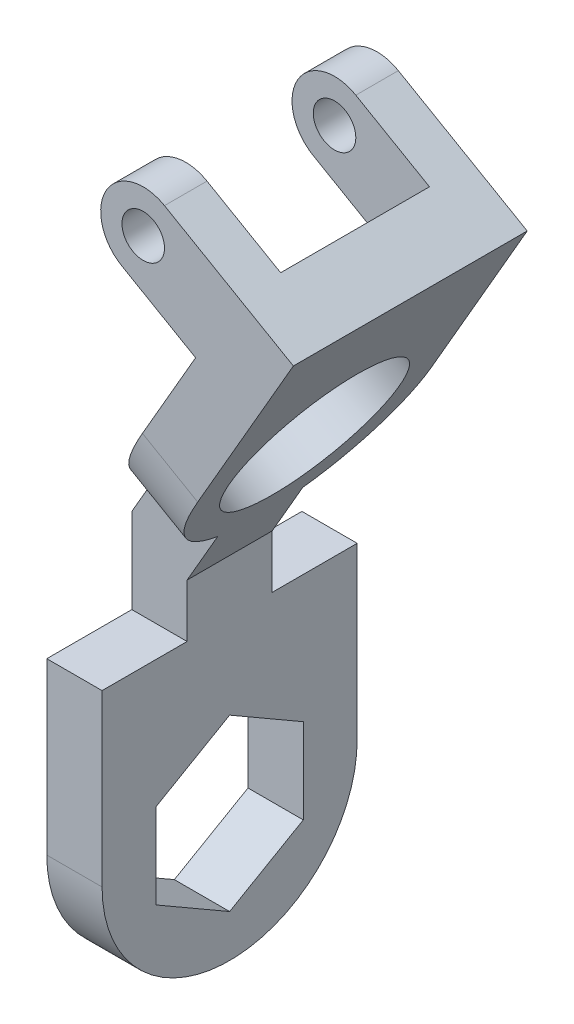
ISO-10303-21;
HEADER;
FILE_DESCRIPTION(('STEP AP214'),'2;1');
FILE_NAME('part.step','',(''),(''),'','','');
FILE_SCHEMA(('AUTOMOTIVE_DESIGN { 1 0 10303 214 1 1 1 1 }'));
ENDSEC;
DATA;
#1=APPLICATION_CONTEXT('core data for automotive mechanical design processes');
#2=APPLICATION_PROTOCOL_DEFINITION('international standard','automotive_design',2000,#1);
#3=PRODUCT_CONTEXT('',#1,'mechanical');
#4=PRODUCT('Part','Part','',(#3));
#5=PRODUCT_RELATED_PRODUCT_CATEGORY('part','',(#4));
#6=PRODUCT_DEFINITION_FORMATION('','',#4);
#7=PRODUCT_DEFINITION_CONTEXT('part definition',#1,'design');
#8=PRODUCT_DEFINITION('design','',#6,#7);
#9=PRODUCT_DEFINITION_SHAPE('','',#8);
#10=(LENGTH_UNIT() NAMED_UNIT(*) SI_UNIT(.MILLI.,.METRE.));
#11=(NAMED_UNIT(*) PLANE_ANGLE_UNIT() SI_UNIT($,.RADIAN.));
#12=(NAMED_UNIT(*) SI_UNIT($,.STERADIAN.) SOLID_ANGLE_UNIT());
#13=UNCERTAINTY_MEASURE_WITH_UNIT(LENGTH_MEASURE(1.E-05),#10,'distance_accuracy_value','');
#14=(GEOMETRIC_REPRESENTATION_CONTEXT(3) GLOBAL_UNCERTAINTY_ASSIGNED_CONTEXT((#13)) GLOBAL_UNIT_ASSIGNED_CONTEXT((#10,
#11,#12)) REPRESENTATION_CONTEXT('',''));
#15=CARTESIAN_POINT('',(0.,0.,0.));
#16=DIRECTION('',(0.,0.,1.));
#17=DIRECTION('',(1.,0.,0.));
#18=AXIS2_PLACEMENT_3D('',#15,#16,#17);
#19=CARTESIAN_POINT('',(70.4727839420931,160.162442338531,34.925));
#20=DIRECTION('',(-0.499999999999995,-0.866025403784442,0.));
#21=DIRECTION('',(0.866025403784442,-0.499999999999995,0.));
#22=AXIS2_PLACEMENT_3D('',#19,#20,#21);
#23=PLANE('',#22);
#24=DIRECTION('',(-0.866025403784439,0.5,0.));
#25=VECTOR('',#24,1.);
#26=CARTESIAN_POINT('',(53.9749999999994,169.68744233853,-22.225));
#27=LINE('',#26,#25);
#28=CARTESIAN_POINT('',(53.9749999999994,169.68744233853,-22.225));
#29=VERTEX_POINT('',#28);
#30=CARTESIAN_POINT('',(31.9779547438747,182.38744233853,-22.225));
#31=VERTEX_POINT('',#30);
#32=EDGE_CURVE('E230',#29,#31,#27,.T.);
#33=ORIENTED_EDGE('',*,*,#32,.F.);
#34=DIRECTION('',(0.,0.,1.));
#35=VECTOR('',#34,1.);
#36=CARTESIAN_POINT('',(53.9749999999994,169.68744233853,-22.225));
#37=LINE('',#36,#35);
#38=CARTESIAN_POINT('',(53.9749999999994,169.68744233853,22.225));
#39=VERTEX_POINT('',#38);
#40=EDGE_CURVE('E213',#29,#39,#37,.T.);
#41=ORIENTED_EDGE('',*,*,#40,.T.);
#42=DIRECTION('',(-0.866025403784439,0.5,0.));
#43=VECTOR('',#42,1.);
#44=CARTESIAN_POINT('',(53.9749999999994,169.68744233853,22.225));
#45=LINE('',#44,#43);
#46=CARTESIAN_POINT('',(31.9779547438747,182.38744233853,22.225));
#47=VERTEX_POINT('',#46);
#48=EDGE_CURVE('E245',#39,#47,#45,.T.);
#49=ORIENTED_EDGE('',*,*,#48,.T.);
#50=DIRECTION('',(0.,0.,1.));
#51=VECTOR('',#50,1.);
#52=CARTESIAN_POINT('',(31.9779547438747,182.38744233853,-34.925));
#53=LINE('',#52,#51);
#54=CARTESIAN_POINT('',(31.9779547438747,182.38744233853,34.925));
#55=VERTEX_POINT('',#54);
#56=EDGE_CURVE('E266',#47,#55,#53,.T.);
#57=ORIENTED_EDGE('',*,*,#56,.T.);
#58=DIRECTION('',(-0.866025403784442,0.499999999999995,0.));
#59=VECTOR('',#58,1.);
#60=CARTESIAN_POINT('',(70.4727839420931,160.162442338531,34.925));
#61=LINE('',#60,#59);
#62=CARTESIAN_POINT('',(70.4727839420931,160.162442338531,34.925));
#63=VERTEX_POINT('',#62);
#64=EDGE_CURVE('E316',#63,#55,#61,.T.);
#65=ORIENTED_EDGE('',*,*,#64,.F.);
#66=DIRECTION('',(0.,0.,1.));
#67=VECTOR('',#66,1.);
#68=CARTESIAN_POINT('',(70.4727839420931,160.162442338531,34.925));
#69=LINE('',#68,#67);
#70=CARTESIAN_POINT('',(70.4727839420931,160.162442338531,-34.925));
#71=VERTEX_POINT('',#70);
#72=EDGE_CURVE('E288',#71,#63,#69,.T.);
#73=ORIENTED_EDGE('',*,*,#72,.F.);
#74=DIRECTION('',(-0.866025403784442,0.499999999999995,0.));
#75=VECTOR('',#74,1.);
#76=CARTESIAN_POINT('',(70.4727839420931,160.162442338531,-34.925));
#77=LINE('',#76,#75);
#78=CARTESIAN_POINT('',(31.9779547438747,182.38744233853,-34.925));
#79=VERTEX_POINT('',#78);
#80=EDGE_CURVE('E319',#71,#79,#77,.T.);
#81=ORIENTED_EDGE('',*,*,#80,.T.);
#82=EDGE_CURVE('E237',#79,#31,#53,.T.);
#83=ORIENTED_EDGE('',*,*,#82,.T.);
#84=EDGE_LOOP('',(#33,#41,#49,#57,#65,#73,#81,#83));
#85=FACE_BOUND('',#84,.T.);
#86=ADVANCED_FACE('F39',(#85),#23,.F.);
#87=CARTESIAN_POINT('',(19.2779547438748,160.390397082406,-34.925));
#88=DIRECTION('',(-0.5,-0.866025403784439,0.));
#89=DIRECTION('',(0.866025403784439,-0.5,0.));
#90=AXIS2_PLACEMENT_3D('',#87,#88,#89);
#91=PLANE('',#90);
#92=DIRECTION('',(0.,0.,1.));
#93=VECTOR('',#92,1.);
#94=CARTESIAN_POINT('',(41.2749999999995,147.690397082406,-34.925));
#95=LINE('',#94,#93);
#96=CARTESIAN_POINT('',(41.2749999999995,147.690397082406,-34.925));
#97=VERTEX_POINT('',#96);
#98=CARTESIAN_POINT('',(41.2749999999995,147.690397082406,-22.225));
#99=VERTEX_POINT('',#98);
#100=EDGE_CURVE('E267',#97,#99,#95,.T.);
#101=ORIENTED_EDGE('',*,*,#100,.T.);
#102=DIRECTION('',(0.866025403784439,-0.5,0.));
#103=VECTOR('',#102,1.);
#104=CARTESIAN_POINT('',(19.2779547438748,160.390397082406,-22.225));
#105=LINE('',#104,#103);
#106=CARTESIAN_POINT('',(19.2779547438748,160.390397082406,-22.225));
#107=VERTEX_POINT('',#106);
#108=EDGE_CURVE('E226',#107,#99,#105,.T.);
#109=ORIENTED_EDGE('',*,*,#108,.F.);
#110=DIRECTION('',(0.,0.,1.));
#111=VECTOR('',#110,1.);
#112=CARTESIAN_POINT('',(19.2779547438748,160.390397082406,-34.925));
#113=LINE('',#112,#111);
#114=CARTESIAN_POINT('',(19.2779547438748,160.390397082406,-34.925));
#115=VERTEX_POINT('',#114);
#116=EDGE_CURVE('E270',#115,#107,#113,.T.);
#117=ORIENTED_EDGE('',*,*,#116,.F.);
#118=DIRECTION('',(0.866025403784439,-0.5,0.));
#119=VECTOR('',#118,1.);
#120=CARTESIAN_POINT('',(19.2779547438748,160.390397082406,-34.925));
#121=LINE('',#120,#119);
#122=EDGE_CURVE('E264',#115,#97,#121,.T.);
#123=ORIENTED_EDGE('',*,*,#122,.T.);
#124=EDGE_LOOP('',(#101,#109,#117,#123));
#125=FACE_BOUND('',#124,.T.);
#126=ADVANCED_FACE('F484',(#125),#91,.T.);
#127=CARTESIAN_POINT('',(25.6279547438747,171.388919710468,-34.925));
#128=DIRECTION('',(0.,0.,1.));
#129=DIRECTION('',(1.,0.,0.));
#130=AXIS2_PLACEMENT_3D('',#127,#128,#129);
#131=CYLINDRICAL_SURFACE('',#130,12.6999999999999);
#132=ORIENTED_EDGE('',*,*,#116,.T.);
#133=CARTESIAN_POINT('',(25.6279547438747,171.388919710468,-22.225));
#134=DIRECTION('',(0.,0.,1.));
#135=DIRECTION('',(1.,0.,0.));
#136=AXIS2_PLACEMENT_3D('',#133,#134,#135);
#137=CIRCLE('',#136,12.6999999999999);
#138=EDGE_CURVE('E238',#31,#107,#137,.T.);
#139=ORIENTED_EDGE('',*,*,#138,.F.);
#140=ORIENTED_EDGE('',*,*,#82,.F.);
#141=CARTESIAN_POINT('',(25.6279547438747,171.388919710468,-34.925));
#142=DIRECTION('',(0.,0.,1.));
#143=DIRECTION('',(1.,0.,0.));
#144=AXIS2_PLACEMENT_3D('',#141,#142,#143);
#145=CIRCLE('',#144,12.6999999999999);
#146=EDGE_CURVE('E261',#79,#115,#145,.T.);
#147=ORIENTED_EDGE('',*,*,#146,.T.);
#148=EDGE_LOOP('',(#132,#139,#140,#147));
#149=FACE_BOUND('',#148,.T.);
#150=ADVANCED_FACE('F489',(#149),#131,.T.);
#151=CARTESIAN_POINT('',(25.6279547438747,171.388919710468,-34.925));
#152=DIRECTION('',(0.,0.,1.));
#153=DIRECTION('',(1.,0.,0.));
#154=AXIS2_PLACEMENT_3D('',#151,#152,#153);
#155=CYLINDRICAL_SURFACE('',#154,6.35);
#156=CARTESIAN_POINT('',(25.6279547438747,171.388919710468,-34.925));
#157=DIRECTION('',(0.,0.,1.));
#158=DIRECTION('',(1.,0.,0.));
#159=AXIS2_PLACEMENT_3D('',#156,#157,#158);
#160=CIRCLE('',#159,6.35);
#161=CARTESIAN_POINT('',(31.9779547438747,171.388919710468,-34.925));
#162=VERTEX_POINT('',#161);
#163=EDGE_CURVE('E258',#162,#162,#160,.T.);
#164=ORIENTED_EDGE('',*,*,#163,.F.);
#165=EDGE_LOOP('',(#164));
#166=FACE_BOUND('',#165,.T.);
#167=CARTESIAN_POINT('',(25.6279547438747,171.388919710468,-22.225));
#168=DIRECTION('',(0.,0.,1.));
#169=DIRECTION('',(1.,0.,0.));
#170=AXIS2_PLACEMENT_3D('',#167,#168,#169);
#171=CIRCLE('',#170,6.35);
#172=CARTESIAN_POINT('',(31.9779547438747,171.388919710468,-22.225));
#173=VERTEX_POINT('',#172);
#174=EDGE_CURVE('E246',#173,#173,#171,.T.);
#175=ORIENTED_EDGE('',*,*,#174,.T.);
#176=EDGE_LOOP('',(#175));
#177=FACE_BOUND('',#176,.T.);
#178=ADVANCED_FACE('F525',(#166,#177),#155,.F.);
#179=CARTESIAN_POINT('',(16.51,0.,0.));
#180=DIRECTION('',(1.,0.,0.));
#181=DIRECTION('',(0.,0.,-1.));
#182=AXIS2_PLACEMENT_3D('',#179,#180,#181);
#183=PLANE('',#182);
#184=DIRECTION('',(0.,0.,-1.));
#185=VECTOR('',#184,1.);
#186=CARTESIAN_POINT('',(16.51,66.6961588329622,0.));
#187=LINE('',#186,#185);
#188=CARTESIAN_POINT('',(16.51,66.6961588329622,12.7));
#189=VERTEX_POINT('',#188);
#190=CARTESIAN_POINT('',(16.51,66.6961588329622,-12.7));
#191=VERTEX_POINT('',#190);
#192=EDGE_CURVE('E327',#189,#191,#187,.T.);
#193=ORIENTED_EDGE('',*,*,#192,.F.);
#194=DIRECTION('',(0.,-1.,0.));
#195=VECTOR('',#194,1.);
#196=CARTESIAN_POINT('',(16.51,76.2,12.7));
#197=LINE('',#196,#195);
#198=CARTESIAN_POINT('',(16.51,50.8,12.7));
#199=VERTEX_POINT('',#198);
#200=EDGE_CURVE('E382',#189,#199,#197,.T.);
#201=ORIENTED_EDGE('',*,*,#200,.T.);
#202=DIRECTION('',(0.,0.,1.));
#203=VECTOR('',#202,1.);
#204=CARTESIAN_POINT('',(16.51,50.8,38.1));
#205=LINE('',#204,#203);
#206=CARTESIAN_POINT('',(16.51,50.8,38.1));
#207=VERTEX_POINT('',#206);
#208=EDGE_CURVE('E384',#199,#207,#205,.T.);
#209=ORIENTED_EDGE('',*,*,#208,.T.);
#210=DIRECTION('',(0.,-1.,0.));
#211=VECTOR('',#210,1.);
#212=CARTESIAN_POINT('',(16.51,0.,38.1));
#213=LINE('',#212,#211);
#214=CARTESIAN_POINT('',(16.51,0.,38.1));
#215=VERTEX_POINT('',#214);
#216=EDGE_CURVE('E386',#207,#215,#213,.T.);
#217=ORIENTED_EDGE('',*,*,#216,.T.);
#218=CARTESIAN_POINT('',(16.51,0.,0.));
#219=DIRECTION('',(1.,0.,0.));
#220=DIRECTION('',(0.,0.,-1.));
#221=AXIS2_PLACEMENT_3D('',#218,#219,#220);
#222=CIRCLE('',#221,38.1);
#223=CARTESIAN_POINT('',(16.51,0.,-38.1));
#224=VERTEX_POINT('',#223);
#225=EDGE_CURVE('E388',#215,#224,#222,.T.);
#226=ORIENTED_EDGE('',*,*,#225,.T.);
#227=DIRECTION('',(0.,1.,0.));
#228=VECTOR('',#227,1.);
#229=CARTESIAN_POINT('',(16.51,0.,-38.1));
#230=LINE('',#229,#228);
#231=CARTESIAN_POINT('',(16.51,50.8,-38.1));
#232=VERTEX_POINT('',#231);
#233=EDGE_CURVE('E390',#224,#232,#230,.T.);
#234=ORIENTED_EDGE('',*,*,#233,.T.);
#235=DIRECTION('',(0.,0.,1.));
#236=VECTOR('',#235,1.);
#237=CARTESIAN_POINT('',(16.51,50.8,-12.7));
#238=LINE('',#237,#236);
#239=CARTESIAN_POINT('',(16.51,50.8,-12.7));
#240=VERTEX_POINT('',#239);
#241=EDGE_CURVE('E376',#232,#240,#238,.T.);
#242=ORIENTED_EDGE('',*,*,#241,.T.);
#243=DIRECTION('',(0.,1.,0.));
#244=VECTOR('',#243,1.);
#245=CARTESIAN_POINT('',(16.51,76.2,-12.7));
#246=LINE('',#245,#244);
#247=EDGE_CURVE('E379',#240,#191,#246,.T.);
#248=ORIENTED_EDGE('',*,*,#247,.T.);
#249=EDGE_LOOP('',(#193,#201,#209,#217,#226,#234,#242,#248));
#250=FACE_BOUND('',#249,.T.);
#251=DIRECTION('',(0.,-0.5,0.866025403784439));
#252=VECTOR('',#251,1.);
#253=CARTESIAN_POINT('',(16.51,25.4,0.));
#254=LINE('',#253,#252);
#255=CARTESIAN_POINT('',(16.51,25.4,0.));
#256=VERTEX_POINT('',#255);
#257=CARTESIAN_POINT('',(16.51,12.7,21.9970452561247));
#258=VERTEX_POINT('',#257);
#259=EDGE_CURVE('E333',#256,#258,#254,.T.);
#260=ORIENTED_EDGE('',*,*,#259,.F.);
#261=DIRECTION('',(0.,0.5,0.866025403784439));
#262=VECTOR('',#261,1.);
#263=CARTESIAN_POINT('',(16.51,12.7,-21.9970452561247));
#264=LINE('',#263,#262);
#265=CARTESIAN_POINT('',(16.51,12.7,-21.9970452561247));
#266=VERTEX_POINT('',#265);
#267=EDGE_CURVE('E331',#266,#256,#264,.T.);
#268=ORIENTED_EDGE('',*,*,#267,.F.);
#269=DIRECTION('',(0.,1.,0.));
#270=VECTOR('',#269,1.);
#271=CARTESIAN_POINT('',(16.51,-12.7,-21.9970452561247));
#272=LINE('',#271,#270);
#273=CARTESIAN_POINT('',(16.51,-12.7,-21.9970452561247));
#274=VERTEX_POINT('',#273);
#275=EDGE_CURVE('E343',#274,#266,#272,.T.);
#276=ORIENTED_EDGE('',*,*,#275,.F.);
#277=DIRECTION('',(0.,0.5,-0.866025403784439));
#278=VECTOR('',#277,1.);
#279=CARTESIAN_POINT('',(16.51,-25.4,0.));
#280=LINE('',#279,#278);
#281=CARTESIAN_POINT('',(16.51,-25.4,0.));
#282=VERTEX_POINT('',#281);
#283=EDGE_CURVE('E340',#282,#274,#280,.T.);
#284=ORIENTED_EDGE('',*,*,#283,.F.);
#285=DIRECTION('',(0.,-0.5,-0.866025403784439));
#286=VECTOR('',#285,1.);
#287=CARTESIAN_POINT('',(16.51,-12.7,21.9970452561247));
#288=LINE('',#287,#286);
#289=CARTESIAN_POINT('',(16.51,-12.7,21.9970452561247));
#290=VERTEX_POINT('',#289);
#291=EDGE_CURVE('E338',#290,#282,#288,.T.);
#292=ORIENTED_EDGE('',*,*,#291,.F.);
#293=DIRECTION('',(0.,-1.,0.));
#294=VECTOR('',#293,1.);
#295=CARTESIAN_POINT('',(16.51,12.7,21.9970452561247));
#296=LINE('',#295,#294);
#297=EDGE_CURVE('E336',#258,#290,#296,.T.);
#298=ORIENTED_EDGE('',*,*,#297,.F.);
#299=EDGE_LOOP('',(#260,#268,#276,#284,#292,#298));
#300=FACE_BOUND('',#299,.T.);
#301=ADVANCED_FACE('F446',(#250,#300),#183,.T.);
#302=CARTESIAN_POINT('',(0.,0.,0.));
#303=DIRECTION('',(1.,0.,0.));
#304=DIRECTION('',(0.,0.,-1.));
#305=AXIS2_PLACEMENT_3D('',#302,#303,#304);
#306=PLANE('',#305);
#307=DIRECTION('',(0.,0.,1.));
#308=VECTOR('',#307,1.);
#309=CARTESIAN_POINT('',(0.,50.8,-12.7));
#310=LINE('',#309,#308);
#311=CARTESIAN_POINT('',(0.,50.8,-38.1));
#312=VERTEX_POINT('',#311);
#313=CARTESIAN_POINT('',(0.,50.8,-12.7));
#314=VERTEX_POINT('',#313);
#315=EDGE_CURVE('E375',#312,#314,#310,.T.);
#316=ORIENTED_EDGE('',*,*,#315,.F.);
#317=DIRECTION('',(0.,1.,0.));
#318=VECTOR('',#317,1.);
#319=CARTESIAN_POINT('',(0.,0.,-38.1));
#320=LINE('',#319,#318);
#321=CARTESIAN_POINT('',(0.,0.,-38.1));
#322=VERTEX_POINT('',#321);
#323=EDGE_CURVE('E380',#322,#312,#320,.T.);
#324=ORIENTED_EDGE('',*,*,#323,.F.);
#325=CARTESIAN_POINT('',(0.,0.,0.));
#326=DIRECTION('',(1.,0.,0.));
#327=DIRECTION('',(0.,0.,-1.));
#328=AXIS2_PLACEMENT_3D('',#325,#326,#327);
#329=CIRCLE('',#328,38.1);
#330=CARTESIAN_POINT('',(0.,0.,38.1));
#331=VERTEX_POINT('',#330);
#332=EDGE_CURVE('E406',#331,#322,#329,.T.);
#333=ORIENTED_EDGE('',*,*,#332,.F.);
#334=DIRECTION('',(0.,-1.,0.));
#335=VECTOR('',#334,1.);
#336=CARTESIAN_POINT('',(0.,0.,38.1));
#337=LINE('',#336,#335);
#338=CARTESIAN_POINT('',(0.,50.8,38.1));
#339=VERTEX_POINT('',#338);
#340=EDGE_CURVE('E404',#339,#331,#337,.T.);
#341=ORIENTED_EDGE('',*,*,#340,.F.);
#342=DIRECTION('',(0.,0.,1.));
#343=VECTOR('',#342,1.);
#344=CARTESIAN_POINT('',(0.,50.8,38.1));
#345=LINE('',#344,#343);
#346=CARTESIAN_POINT('',(0.,50.8,12.7));
#347=VERTEX_POINT('',#346);
#348=EDGE_CURVE('E402',#347,#339,#345,.T.);
#349=ORIENTED_EDGE('',*,*,#348,.F.);
#350=DIRECTION('',(0.,-1.,0.));
#351=VECTOR('',#350,1.);
#352=CARTESIAN_POINT('',(0.,76.2,12.7));
#353=LINE('',#352,#351);
#354=CARTESIAN_POINT('',(0.,76.2,12.7));
#355=VERTEX_POINT('',#354);
#356=EDGE_CURVE('E400',#355,#347,#353,.T.);
#357=ORIENTED_EDGE('',*,*,#356,.F.);
#358=DIRECTION('',(0.,0.,1.));
#359=VECTOR('',#358,1.);
#360=CARTESIAN_POINT('',(0.,76.2,-12.7));
#361=LINE('',#360,#359);
#362=CARTESIAN_POINT('',(0.,76.2,-12.7));
#363=VERTEX_POINT('',#362);
#364=EDGE_CURVE('E397',#363,#355,#361,.T.);
#365=ORIENTED_EDGE('',*,*,#364,.F.);
#366=DIRECTION('',(0.,1.,0.));
#367=VECTOR('',#366,1.);
#368=CARTESIAN_POINT('',(0.,76.2,-12.7));
#369=LINE('',#368,#367);
#370=EDGE_CURVE('E395',#314,#363,#369,.T.);
#371=ORIENTED_EDGE('',*,*,#370,.F.);
#372=EDGE_LOOP('',(#316,#324,#333,#341,#349,#357,#365,#371));
#373=FACE_BOUND('',#372,.T.);
#374=DIRECTION('',(0.,0.5,0.866025403784439));
#375=VECTOR('',#374,1.);
#376=CARTESIAN_POINT('',(0.,12.7,-21.9970452561247));
#377=LINE('',#376,#375);
#378=CARTESIAN_POINT('',(0.,12.7,-21.9970452561247));
#379=VERTEX_POINT('',#378);
#380=CARTESIAN_POINT('',(0.,25.4,0.));
#381=VERTEX_POINT('',#380);
#382=EDGE_CURVE('E330',#379,#381,#377,.T.);
#383=ORIENTED_EDGE('',*,*,#382,.T.);
#384=DIRECTION('',(0.,-0.5,0.866025403784439));
#385=VECTOR('',#384,1.);
#386=CARTESIAN_POINT('',(0.,25.4,0.));
#387=LINE('',#386,#385);
#388=CARTESIAN_POINT('',(0.,12.7,21.9970452561247));
#389=VERTEX_POINT('',#388);
#390=EDGE_CURVE('E348',#381,#389,#387,.T.);
#391=ORIENTED_EDGE('',*,*,#390,.T.);
#392=DIRECTION('',(0.,-1.,0.));
#393=VECTOR('',#392,1.);
#394=CARTESIAN_POINT('',(0.,12.7,21.9970452561247));
#395=LINE('',#394,#393);
#396=CARTESIAN_POINT('',(0.,-12.7,21.9970452561247));
#397=VERTEX_POINT('',#396);
#398=EDGE_CURVE('E351',#389,#397,#395,.T.);
#399=ORIENTED_EDGE('',*,*,#398,.T.);
#400=DIRECTION('',(0.,-0.5,-0.866025403784439));
#401=VECTOR('',#400,1.);
#402=CARTESIAN_POINT('',(0.,-12.7,21.9970452561247));
#403=LINE('',#402,#401);
#404=CARTESIAN_POINT('',(0.,-25.4,0.));
#405=VERTEX_POINT('',#404);
#406=EDGE_CURVE('E354',#397,#405,#403,.T.);
#407=ORIENTED_EDGE('',*,*,#406,.T.);
#408=DIRECTION('',(0.,0.5,-0.866025403784439));
#409=VECTOR('',#408,1.);
#410=CARTESIAN_POINT('',(0.,-25.4,0.));
#411=LINE('',#410,#409);
#412=CARTESIAN_POINT('',(0.,-12.7,-21.9970452561247));
#413=VERTEX_POINT('',#412);
#414=EDGE_CURVE('E357',#405,#413,#411,.T.);
#415=ORIENTED_EDGE('',*,*,#414,.T.);
#416=DIRECTION('',(0.,1.,0.));
#417=VECTOR('',#416,1.);
#418=CARTESIAN_POINT('',(0.,-12.7,-21.9970452561247));
#419=LINE('',#418,#417);
#420=EDGE_CURVE('E334',#413,#379,#419,.T.);
#421=ORIENTED_EDGE('',*,*,#420,.T.);
#422=EDGE_LOOP('',(#383,#391,#399,#407,#415,#421));
#423=FACE_BOUND('',#422,.T.);
#424=ADVANCED_FACE('F431',(#373,#423),#306,.F.);
#425=CARTESIAN_POINT('',(16.51,50.8,-12.7));
#426=DIRECTION('',(0.,-1.,0.));
#427=DIRECTION('',(0.,0.,-1.));
#428=AXIS2_PLACEMENT_3D('',#425,#426,#427);
#429=PLANE('',#428);
#430=ORIENTED_EDGE('',*,*,#315,.T.);
#431=DIRECTION('',(-1.,0.,0.));
#432=VECTOR('',#431,1.);
#433=CARTESIAN_POINT('',(16.51,50.8,-12.7));
#434=LINE('',#433,#432);
#435=EDGE_CURVE('E11',#240,#314,#434,.T.);
#436=ORIENTED_EDGE('',*,*,#435,.F.);
#437=ORIENTED_EDGE('',*,*,#241,.F.);
#438=DIRECTION('',(-1.,0.,0.));
#439=VECTOR('',#438,1.);
#440=CARTESIAN_POINT('',(16.51,50.8,-38.1));
#441=LINE('',#440,#439);
#442=EDGE_CURVE('E392',#232,#312,#441,.T.);
#443=ORIENTED_EDGE('',*,*,#442,.T.);
#444=EDGE_LOOP('',(#430,#436,#437,#443));
#445=FACE_BOUND('',#444,.T.);
#446=ADVANCED_FACE('F41',(#445),#429,.F.);
#447=CARTESIAN_POINT('',(16.51,76.2,-12.7));
#448=DIRECTION('',(0.,0.,1.));
#449=DIRECTION('',(0.,-1.,0.));
#450=AXIS2_PLACEMENT_3D('',#447,#448,#449);
#451=PLANE('',#450);
#452=DIRECTION('',(0.499999999999995,0.866025403784441,0.));
#453=VECTOR('',#452,1.);
#454=CARTESIAN_POINT('',(16.4977839420936,66.6750000000001,-12.7));
#455=LINE('',#454,#453);
#456=CARTESIAN_POINT('',(25.6307496011327,82.4937605452377,-12.7));
#457=VERTEX_POINT('',#456);
#458=EDGE_CURVE('E281',#191,#457,#455,.T.);
#459=ORIENTED_EDGE('',*,*,#458,.F.);
#460=ORIENTED_EDGE('',*,*,#247,.F.);
#461=ORIENTED_EDGE('',*,*,#435,.T.);
#462=ORIENTED_EDGE('',*,*,#370,.T.);
#463=DIRECTION('',(0.499999999999995,0.866025403784441,0.));
#464=VECTOR('',#463,1.);
#465=CARTESIAN_POINT('',(0.,76.2,-12.7));
#466=LINE('',#465,#464);
#467=CARTESIAN_POINT('',(9.13296565903905,92.0187605452376,-12.7));
#468=VERTEX_POINT('',#467);
#469=EDGE_CURVE('E278',#363,#468,#466,.T.);
#470=ORIENTED_EDGE('',*,*,#469,.T.);
#471=DIRECTION('',(-0.866025403784442,0.499999999999995,0.));
#472=VECTOR('',#471,1.);
#473=CARTESIAN_POINT('',(25.6307496011327,82.4937605452377,-12.7));
#474=LINE('',#473,#472);
#475=EDGE_CURVE('E324',#457,#468,#474,.T.);
#476=ORIENTED_EDGE('',*,*,#475,.F.);
#477=EDGE_LOOP('',(#459,#460,#461,#462,#470,#476));
#478=FACE_BOUND('',#477,.T.);
#479=ADVANCED_FACE('F466',(#478),#451,.F.);
#480=CARTESIAN_POINT('',(16.51,76.2,12.7));
#481=DIRECTION('',(0.,0.,-1.));
#482=DIRECTION('',(0.,1.,0.));
#483=AXIS2_PLACEMENT_3D('',#480,#481,#482);
#484=PLANE('',#483);
#485=ORIENTED_EDGE('',*,*,#200,.F.);
#486=DIRECTION('',(-0.499999999999995,-0.866025403784441,0.));
#487=VECTOR('',#486,1.);
#488=CARTESIAN_POINT('',(16.4977839420936,66.6750000000001,12.7));
#489=LINE('',#488,#487);
#490=CARTESIAN_POINT('',(25.6307496011327,82.4937605452377,12.7));
#491=VERTEX_POINT('',#490);
#492=EDGE_CURVE('E294',#491,#189,#489,.T.);
#493=ORIENTED_EDGE('',*,*,#492,.F.);
#494=DIRECTION('',(-0.866025403784442,0.499999999999995,0.));
#495=VECTOR('',#494,1.);
#496=CARTESIAN_POINT('',(25.6307496011327,82.4937605452377,12.7));
#497=LINE('',#496,#495);
#498=CARTESIAN_POINT('',(9.13296565903905,92.0187605452376,12.7));
#499=VERTEX_POINT('',#498);
#500=EDGE_CURVE('E297',#491,#499,#497,.T.);
#501=ORIENTED_EDGE('',*,*,#500,.T.);
#502=DIRECTION('',(-0.499999999999995,-0.866025403784441,0.));
#503=VECTOR('',#502,1.);
#504=CARTESIAN_POINT('',(0.,76.2,12.7));
#505=LINE('',#504,#503);
#506=EDGE_CURVE('E284',#499,#355,#505,.T.);
#507=ORIENTED_EDGE('',*,*,#506,.T.);
#508=ORIENTED_EDGE('',*,*,#356,.T.);
#509=DIRECTION('',(-1.,0.,0.));
#510=VECTOR('',#509,1.);
#511=CARTESIAN_POINT('',(16.51,50.8,12.7));
#512=LINE('',#511,#510);
#513=EDGE_CURVE('E47',#199,#347,#512,.T.);
#514=ORIENTED_EDGE('',*,*,#513,.F.);
#515=EDGE_LOOP('',(#485,#493,#501,#507,#508,#514));
#516=FACE_BOUND('',#515,.T.);
#517=ADVANCED_FACE('F450',(#516),#484,.F.);
#518=CARTESIAN_POINT('',(16.51,50.8,38.1));
#519=DIRECTION('',(0.,-1.,0.));
#520=DIRECTION('',(0.,0.,-1.));
#521=AXIS2_PLACEMENT_3D('',#518,#519,#520);
#522=PLANE('',#521);
#523=ORIENTED_EDGE('',*,*,#348,.T.);
#524=DIRECTION('',(-1.,0.,0.));
#525=VECTOR('',#524,1.);
#526=CARTESIAN_POINT('',(16.51,50.8,38.1));
#527=LINE('',#526,#525);
#528=EDGE_CURVE('E417',#207,#339,#527,.T.);
#529=ORIENTED_EDGE('',*,*,#528,.F.);
#530=ORIENTED_EDGE('',*,*,#208,.F.);
#531=ORIENTED_EDGE('',*,*,#513,.T.);
#532=EDGE_LOOP('',(#523,#529,#530,#531));
#533=FACE_BOUND('',#532,.T.);
#534=ADVANCED_FACE('F424',(#533),#522,.F.);
#535=CARTESIAN_POINT('',(16.51,0.,38.1));
#536=DIRECTION('',(0.,0.,-1.));
#537=DIRECTION('',(-1.,0.,0.));
#538=AXIS2_PLACEMENT_3D('',#535,#536,#537);
#539=PLANE('',#538);
#540=ORIENTED_EDGE('',*,*,#340,.T.);
#541=DIRECTION('',(-1.,0.,0.));
#542=VECTOR('',#541,1.);
#543=CARTESIAN_POINT('',(16.51,0.,38.1));
#544=LINE('',#543,#542);
#545=EDGE_CURVE('E414',#215,#331,#544,.T.);
#546=ORIENTED_EDGE('',*,*,#545,.F.);
#547=ORIENTED_EDGE('',*,*,#216,.F.);
#548=ORIENTED_EDGE('',*,*,#528,.T.);
#549=EDGE_LOOP('',(#540,#546,#547,#548));
#550=FACE_BOUND('',#549,.T.);
#551=ADVANCED_FACE('F438',(#550),#539,.F.);
#552=CARTESIAN_POINT('',(16.51,0.,0.));
#553=DIRECTION('',(-1.,0.,0.));
#554=DIRECTION('',(0.,0.,1.));
#555=AXIS2_PLACEMENT_3D('',#552,#553,#554);
#556=CYLINDRICAL_SURFACE('',#555,38.1);
#557=ORIENTED_EDGE('',*,*,#332,.T.);
#558=DIRECTION('',(-1.,0.,0.));
#559=VECTOR('',#558,1.);
#560=CARTESIAN_POINT('',(16.51,0.,-38.1));
#561=LINE('',#560,#559);
#562=EDGE_CURVE('E411',#224,#322,#561,.T.);
#563=ORIENTED_EDGE('',*,*,#562,.F.);
#564=ORIENTED_EDGE('',*,*,#225,.F.);
#565=ORIENTED_EDGE('',*,*,#545,.T.);
#566=EDGE_LOOP('',(#557,#563,#564,#565));
#567=FACE_BOUND('',#566,.T.);
#568=ADVANCED_FACE('F442',(#567),#556,.T.);
#569=CARTESIAN_POINT('',(16.51,0.,-38.1));
#570=DIRECTION('',(0.,0.,1.));
#571=DIRECTION('',(0.,-1.,0.));
#572=AXIS2_PLACEMENT_3D('',#569,#570,#571);
#573=PLANE('',#572);
#574=ORIENTED_EDGE('',*,*,#323,.T.);
#575=ORIENTED_EDGE('',*,*,#442,.F.);
#576=ORIENTED_EDGE('',*,*,#233,.F.);
#577=ORIENTED_EDGE('',*,*,#562,.T.);
#578=EDGE_LOOP('',(#574,#575,#576,#577));
#579=FACE_BOUND('',#578,.T.);
#580=ADVANCED_FACE('F470',(#579),#573,.F.);
#581=CARTESIAN_POINT('',(16.51,12.7,-21.9970452561247));
#582=DIRECTION('',(0.,-0.866025403784439,0.5));
#583=DIRECTION('',(0.,-0.5,-0.866025403784439));
#584=AXIS2_PLACEMENT_3D('',#581,#582,#583);
#585=PLANE('',#584);
#586=ORIENTED_EDGE('',*,*,#382,.F.);
#587=DIRECTION('',(-1.,0.,0.));
#588=VECTOR('',#587,1.);
#589=CARTESIAN_POINT('',(16.51,12.7,-21.9970452561247));
#590=LINE('',#589,#588);
#591=EDGE_CURVE('E345',#266,#379,#590,.T.);
#592=ORIENTED_EDGE('',*,*,#591,.F.);
#593=ORIENTED_EDGE('',*,*,#267,.T.);
#594=DIRECTION('',(-1.,0.,0.));
#595=VECTOR('',#594,1.);
#596=CARTESIAN_POINT('',(16.51,25.4,0.));
#597=LINE('',#596,#595);
#598=EDGE_CURVE('E372',#256,#381,#597,.T.);
#599=ORIENTED_EDGE('',*,*,#598,.T.);
#600=EDGE_LOOP('',(#586,#592,#593,#599));
#601=FACE_BOUND('',#600,.T.);
#602=ADVANCED_FACE('F472',(#601),#585,.T.);
#603=CARTESIAN_POINT('',(16.51,25.4,0.));
#604=DIRECTION('',(0.,-0.866025403784439,-0.5));
#605=DIRECTION('',(0.,0.5,-0.866025403784439));
#606=AXIS2_PLACEMENT_3D('',#603,#604,#605);
#607=PLANE('',#606);
#608=ORIENTED_EDGE('',*,*,#390,.F.);
#609=ORIENTED_EDGE('',*,*,#598,.F.);
#610=ORIENTED_EDGE('',*,*,#259,.T.);
#611=DIRECTION('',(-1.,0.,0.));
#612=VECTOR('',#611,1.);
#613=CARTESIAN_POINT('',(16.51,12.7,21.9970452561247));
#614=LINE('',#613,#612);
#615=EDGE_CURVE('E370',#258,#389,#614,.T.);
#616=ORIENTED_EDGE('',*,*,#615,.T.);
#617=EDGE_LOOP('',(#608,#609,#610,#616));
#618=FACE_BOUND('',#617,.T.);
#619=ADVANCED_FACE('F478',(#618),#607,.T.);
#620=CARTESIAN_POINT('',(16.51,12.7,21.9970452561247));
#621=DIRECTION('',(0.,0.,-1.));
#622=DIRECTION('',(0.,1.,0.));
#623=AXIS2_PLACEMENT_3D('',#620,#621,#622);
#624=PLANE('',#623);
#625=ORIENTED_EDGE('',*,*,#398,.F.);
#626=ORIENTED_EDGE('',*,*,#615,.F.);
#627=ORIENTED_EDGE('',*,*,#297,.T.);
#628=DIRECTION('',(-1.,0.,0.));
#629=VECTOR('',#628,1.);
#630=CARTESIAN_POINT('',(16.51,-12.7,21.9970452561247));
#631=LINE('',#630,#629);
#632=EDGE_CURVE('E368',#290,#397,#631,.T.);
#633=ORIENTED_EDGE('',*,*,#632,.T.);
#634=EDGE_LOOP('',(#625,#626,#627,#633));
#635=FACE_BOUND('',#634,.T.);
#636=ADVANCED_FACE('F516',(#635),#624,.T.);
#637=CARTESIAN_POINT('',(16.51,-12.7,21.9970452561247));
#638=DIRECTION('',(0.,0.866025403784439,-0.5));
#639=DIRECTION('',(0.,0.5,0.866025403784439));
#640=AXIS2_PLACEMENT_3D('',#637,#638,#639);
#641=PLANE('',#640);
#642=ORIENTED_EDGE('',*,*,#406,.F.);
#643=ORIENTED_EDGE('',*,*,#632,.F.);
#644=ORIENTED_EDGE('',*,*,#291,.T.);
#645=DIRECTION('',(-1.,0.,0.));
#646=VECTOR('',#645,1.);
#647=CARTESIAN_POINT('',(16.51,-25.4,0.));
#648=LINE('',#647,#646);
#649=EDGE_CURVE('E366',#282,#405,#648,.T.);
#650=ORIENTED_EDGE('',*,*,#649,.T.);
#651=EDGE_LOOP('',(#642,#643,#644,#650));
#652=FACE_BOUND('',#651,.T.);
#653=ADVANCED_FACE('F512',(#652),#641,.T.);
#654=CARTESIAN_POINT('',(16.51,-25.4,0.));
#655=DIRECTION('',(0.,0.866025403784439,0.5));
#656=DIRECTION('',(0.,-0.5,0.866025403784439));
#657=AXIS2_PLACEMENT_3D('',#654,#655,#656);
#658=PLANE('',#657);
#659=ORIENTED_EDGE('',*,*,#414,.F.);
#660=ORIENTED_EDGE('',*,*,#649,.F.);
#661=ORIENTED_EDGE('',*,*,#283,.T.);
#662=DIRECTION('',(-1.,0.,0.));
#663=VECTOR('',#662,1.);
#664=CARTESIAN_POINT('',(16.51,-12.7,-21.9970452561247));
#665=LINE('',#664,#663);
#666=EDGE_CURVE('E364',#274,#413,#665,.T.);
#667=ORIENTED_EDGE('',*,*,#666,.T.);
#668=EDGE_LOOP('',(#659,#660,#661,#667));
#669=FACE_BOUND('',#668,.T.);
#670=ADVANCED_FACE('F508',(#669),#658,.T.);
#671=CARTESIAN_POINT('',(16.51,-12.7,-21.9970452561247));
#672=DIRECTION('',(0.,0.,1.));
#673=DIRECTION('',(0.,-1.,0.));
#674=AXIS2_PLACEMENT_3D('',#671,#672,#673);
#675=PLANE('',#674);
#676=ORIENTED_EDGE('',*,*,#420,.F.);
#677=ORIENTED_EDGE('',*,*,#666,.F.);
#678=ORIENTED_EDGE('',*,*,#275,.T.);
#679=ORIENTED_EDGE('',*,*,#591,.T.);
#680=EDGE_LOOP('',(#676,#677,#678,#679));
#681=FACE_BOUND('',#680,.T.);
#682=ADVANCED_FACE('F505',(#681),#675,.T.);
#683=CARTESIAN_POINT('',(41.8977839420934,110.66909051225,0.));
#684=DIRECTION('',(0.866025403784442,-0.499999999999995,0.));
#685=DIRECTION('',(0.499999999999995,0.866025403784442,0.));
#686=AXIS2_PLACEMENT_3D('',#683,#684,#685);
#687=PLANE('',#686);
#688=ORIENTED_EDGE('',*,*,#492,.T.);
#689=ORIENTED_EDGE('',*,*,#192,.T.);
#690=ORIENTED_EDGE('',*,*,#458,.T.);
#691=CARTESIAN_POINT('',(41.8977839420934,110.66909051225,0.));
#692=DIRECTION('',(0.866025403784442,-0.499999999999995,0.));
#693=DIRECTION('',(0.499999999999995,0.866025403784442,0.));
#694=AXIS2_PLACEMENT_3D('',#691,#692,#693);
#695=CIRCLE('',#694,34.925);
#696=CARTESIAN_POINT('',(41.8977839420934,110.66909051225,-34.925));
#697=VERTEX_POINT('',#696);
#698=EDGE_CURVE('E283',#457,#697,#695,.T.);
#699=ORIENTED_EDGE('',*,*,#698,.T.);
#700=DIRECTION('',(0.499999999999995,0.866025403784442,0.));
#701=VECTOR('',#700,1.);
#702=CARTESIAN_POINT('',(41.8977839420934,110.66909051225,-34.925));
#703=LINE('',#702,#701);
#704=EDGE_CURVE('E286',#697,#71,#703,.T.);
#705=ORIENTED_EDGE('',*,*,#704,.T.);
#706=ORIENTED_EDGE('',*,*,#72,.T.);
#707=DIRECTION('',(-0.499999999999995,-0.866025403784442,0.));
#708=VECTOR('',#707,1.);
#709=CARTESIAN_POINT('',(41.8977839420934,110.66909051225,34.925));
#710=LINE('',#709,#708);
#711=CARTESIAN_POINT('',(41.8977839420934,110.66909051225,34.925));
#712=VERTEX_POINT('',#711);
#713=EDGE_CURVE('E290',#63,#712,#710,.T.);
#714=ORIENTED_EDGE('',*,*,#713,.T.);
#715=CARTESIAN_POINT('',(41.8977839420934,110.66909051225,0.));
#716=DIRECTION('',(0.866025403784442,-0.499999999999995,0.));
#717=DIRECTION('',(0.499999999999995,0.866025403784442,0.));
#718=AXIS2_PLACEMENT_3D('',#715,#716,#717);
#719=CIRCLE('',#718,34.925);
#720=EDGE_CURVE('E292',#712,#491,#719,.T.);
#721=ORIENTED_EDGE('',*,*,#720,.T.);
#722=EDGE_LOOP('',(#688,#689,#690,#699,#705,#706,#714,#721));
#723=FACE_BOUND('',#722,.T.);
#724=CARTESIAN_POINT('',(41.8977839420934,110.66909051225,0.));
#725=DIRECTION('',(0.866025403784442,-0.499999999999995,0.));
#726=DIRECTION('',(0.499999999999995,0.866025403784442,0.));
#727=AXIS2_PLACEMENT_3D('',#724,#725,#726);
#728=CIRCLE('',#727,25.4);
#729=CARTESIAN_POINT('',(54.5977839420932,132.666135768375,0.));
#730=VERTEX_POINT('',#729);
#731=EDGE_CURVE('E275',#730,#730,#728,.T.);
#732=ORIENTED_EDGE('',*,*,#731,.F.);
#733=EDGE_LOOP('',(#732));
#734=FACE_BOUND('',#733,.T.);
#735=ADVANCED_FACE('F452',(#723,#734),#687,.T.);
#736=CARTESIAN_POINT('',(25.3999999999997,120.19409051225,0.));
#737=DIRECTION('',(0.866025403784442,-0.499999999999995,0.));
#738=DIRECTION('',(0.499999999999995,0.866025403784442,0.));
#739=AXIS2_PLACEMENT_3D('',#736,#737,#738);
#740=PLANE('',#739);
#741=DIRECTION('',(-0.499999999999995,-0.866025403784442,0.));
#742=VECTOR('',#741,1.);
#743=CARTESIAN_POINT('',(25.3999999999997,120.19409051225,34.925));
#744=LINE('',#743,#742);
#745=CARTESIAN_POINT('',(41.2749999999996,147.690397082406,34.925));
#746=VERTEX_POINT('',#745);
#747=CARTESIAN_POINT('',(25.3999999999997,120.19409051225,34.925));
#748=VERTEX_POINT('',#747);
#749=EDGE_CURVE('E305',#746,#748,#744,.T.);
#750=ORIENTED_EDGE('',*,*,#749,.F.);
#751=CARTESIAN_POINT('',(41.2749999999995,147.690397082406,22.225));
#752=VERTEX_POINT('',#751);
#753=EDGE_CURVE('E61',#752,#746,#95,.T.);
#754=ORIENTED_EDGE('',*,*,#753,.F.);
#755=DIRECTION('',(0.5,0.866025403784439,0.));
#756=VECTOR('',#755,1.);
#757=CARTESIAN_POINT('',(41.2749999999995,147.690397082406,22.225));
#758=LINE('',#757,#756);
#759=EDGE_CURVE('E221',#752,#39,#758,.T.);
#760=ORIENTED_EDGE('',*,*,#759,.T.);
#761=ORIENTED_EDGE('',*,*,#40,.F.);
#762=DIRECTION('',(0.5,0.866025403784439,0.));
#763=VECTOR('',#762,1.);
#764=CARTESIAN_POINT('',(41.2749999999995,147.690397082406,-22.225));
#765=LINE('',#764,#763);
#766=EDGE_CURVE('E219',#99,#29,#765,.T.);
#767=ORIENTED_EDGE('',*,*,#766,.F.);
#768=ORIENTED_EDGE('',*,*,#100,.F.);
#769=DIRECTION('',(0.499999999999995,0.866025403784442,0.));
#770=VECTOR('',#769,1.);
#771=CARTESIAN_POINT('',(25.3999999999997,120.19409051225,-34.925));
#772=LINE('',#771,#770);
#773=CARTESIAN_POINT('',(25.3999999999997,120.19409051225,-34.925));
#774=VERTEX_POINT('',#773);
#775=EDGE_CURVE('E302',#774,#97,#772,.T.);
#776=ORIENTED_EDGE('',*,*,#775,.F.);
#777=CARTESIAN_POINT('',(25.3999999999997,120.19409051225,0.));
#778=DIRECTION('',(0.866025403784442,-0.499999999999995,0.));
#779=DIRECTION('',(0.499999999999995,0.866025403784442,0.));
#780=AXIS2_PLACEMENT_3D('',#777,#778,#779);
#781=CIRCLE('',#780,34.925);
#782=EDGE_CURVE('E300',#468,#774,#781,.T.);
#783=ORIENTED_EDGE('',*,*,#782,.F.);
#784=ORIENTED_EDGE('',*,*,#469,.F.);
#785=ORIENTED_EDGE('',*,*,#364,.T.);
#786=ORIENTED_EDGE('',*,*,#506,.F.);
#787=CARTESIAN_POINT('',(25.3999999999997,120.19409051225,0.));
#788=DIRECTION('',(0.866025403784442,-0.499999999999995,0.));
#789=DIRECTION('',(0.499999999999995,0.866025403784442,0.));
#790=AXIS2_PLACEMENT_3D('',#787,#788,#789);
#791=CIRCLE('',#790,34.925);
#792=EDGE_CURVE('E307',#748,#499,#791,.T.);
#793=ORIENTED_EDGE('',*,*,#792,.F.);
#794=EDGE_LOOP('',(#750,#754,#760,#761,#767,#768,#776,#783,#784,#785,#786,#793));
#795=FACE_BOUND('',#794,.T.);
#796=CARTESIAN_POINT('',(25.3999999999997,120.19409051225,0.));
#797=DIRECTION('',(0.866025403784442,-0.499999999999995,0.));
#798=DIRECTION('',(0.499999999999995,0.866025403784442,0.));
#799=AXIS2_PLACEMENT_3D('',#796,#797,#798);
#800=CIRCLE('',#799,25.4);
#801=CARTESIAN_POINT('',(38.0999999999996,142.191135768374,0.));
#802=VERTEX_POINT('',#801);
#803=EDGE_CURVE('E269',#802,#802,#800,.T.);
#804=ORIENTED_EDGE('',*,*,#803,.T.);
#805=EDGE_LOOP('',(#804));
#806=FACE_BOUND('',#805,.T.);
#807=ADVANCED_FACE('F216',(#795,#806),#740,.F.);
#808=CARTESIAN_POINT('',(41.8977839420934,110.66909051225,0.));
#809=DIRECTION('',(-0.866025403784442,0.499999999999995,0.));
#810=DIRECTION('',(-0.499999999999995,-0.866025403784442,0.));
#811=AXIS2_PLACEMENT_3D('',#808,#809,#810);
#812=CYLINDRICAL_SURFACE('',#811,34.925);
#813=ORIENTED_EDGE('',*,*,#782,.T.);
#814=DIRECTION('',(-0.866025403784442,0.499999999999995,0.));
#815=VECTOR('',#814,1.);
#816=CARTESIAN_POINT('',(41.8977839420934,110.66909051225,-34.925));
#817=LINE('',#816,#815);
#818=EDGE_CURVE('E321',#697,#774,#817,.T.);
#819=ORIENTED_EDGE('',*,*,#818,.F.);
#820=ORIENTED_EDGE('',*,*,#698,.F.);
#821=ORIENTED_EDGE('',*,*,#475,.T.);
#822=EDGE_LOOP('',(#813,#819,#820,#821));
#823=FACE_BOUND('',#822,.T.);
#824=ADVANCED_FACE('F500',(#823),#812,.T.);
#825=CARTESIAN_POINT('',(41.8977839420934,110.66909051225,-34.925));
#826=DIRECTION('',(0.,0.,1.));
#827=DIRECTION('',(0.,-1.,0.));
#828=AXIS2_PLACEMENT_3D('',#825,#826,#827);
#829=PLANE('',#828);
#830=ORIENTED_EDGE('',*,*,#775,.T.);
#831=ORIENTED_EDGE('',*,*,#122,.F.);
#832=ORIENTED_EDGE('',*,*,#146,.F.);
#833=ORIENTED_EDGE('',*,*,#80,.F.);
#834=ORIENTED_EDGE('',*,*,#704,.F.);
#835=ORIENTED_EDGE('',*,*,#818,.T.);
#836=EDGE_LOOP('',(#830,#831,#832,#833,#834,#835));
#837=FACE_BOUND('',#836,.T.);
#838=ORIENTED_EDGE('',*,*,#163,.T.);
#839=EDGE_LOOP('',(#838));
#840=FACE_BOUND('',#839,.T.);
#841=ADVANCED_FACE('F497',(#837,#840),#829,.F.);
#842=CARTESIAN_POINT('',(41.8977839420934,110.66909051225,34.925));
#843=DIRECTION('',(0.,0.,-1.));
#844=DIRECTION('',(0.,1.,0.));
#845=AXIS2_PLACEMENT_3D('',#842,#843,#844);
#846=PLANE('',#845);
#847=ORIENTED_EDGE('',*,*,#64,.T.);
#848=CARTESIAN_POINT('',(25.6279547438747,171.388919710468,34.925));
#849=DIRECTION('',(0.,0.,1.));
#850=DIRECTION('',(1.,0.,0.));
#851=AXIS2_PLACEMENT_3D('',#848,#849,#850);
#852=CIRCLE('',#851,12.6999999999999);
#853=CARTESIAN_POINT('',(19.2779547438748,160.390397082406,34.925));
#854=VERTEX_POINT('',#853);
#855=EDGE_CURVE('E253',#55,#854,#852,.T.);
#856=ORIENTED_EDGE('',*,*,#855,.T.);
#857=DIRECTION('',(0.866025403784439,-0.5,0.));
#858=VECTOR('',#857,1.);
#859=CARTESIAN_POINT('',(19.2779547438748,160.390397082406,34.925));
#860=LINE('',#859,#858);
#861=EDGE_CURVE('E256',#854,#746,#860,.T.);
#862=ORIENTED_EDGE('',*,*,#861,.T.);
#863=ORIENTED_EDGE('',*,*,#749,.T.);
#864=DIRECTION('',(-0.866025403784442,0.499999999999995,0.));
#865=VECTOR('',#864,1.);
#866=CARTESIAN_POINT('',(41.8977839420934,110.66909051225,34.925));
#867=LINE('',#866,#865);
#868=EDGE_CURVE('E313',#712,#748,#867,.T.);
#869=ORIENTED_EDGE('',*,*,#868,.F.);
#870=ORIENTED_EDGE('',*,*,#713,.F.);
#871=EDGE_LOOP('',(#847,#856,#862,#863,#869,#870));
#872=FACE_BOUND('',#871,.T.);
#873=CARTESIAN_POINT('',(25.6279547438747,171.388919710468,34.925));
#874=DIRECTION('',(0.,0.,1.));
#875=DIRECTION('',(1.,0.,0.));
#876=AXIS2_PLACEMENT_3D('',#873,#874,#875);
#877=CIRCLE('',#876,6.35);
#878=CARTESIAN_POINT('',(31.9779547438747,171.388919710468,34.925));
#879=VERTEX_POINT('',#878);
#880=EDGE_CURVE('E225',#879,#879,#877,.T.);
#881=ORIENTED_EDGE('',*,*,#880,.F.);
#882=EDGE_LOOP('',(#881));
#883=FACE_BOUND('',#882,.T.);
#884=ADVANCED_FACE('F495',(#872,#883),#846,.F.);
#885=CARTESIAN_POINT('',(41.8977839420934,110.66909051225,0.));
#886=DIRECTION('',(-0.866025403784442,0.499999999999995,0.));
#887=DIRECTION('',(-0.499999999999995,-0.866025403784442,0.));
#888=AXIS2_PLACEMENT_3D('',#885,#886,#887);
#889=CYLINDRICAL_SURFACE('',#888,34.925);
#890=ORIENTED_EDGE('',*,*,#792,.T.);
#891=ORIENTED_EDGE('',*,*,#500,.F.);
#892=ORIENTED_EDGE('',*,*,#720,.F.);
#893=ORIENTED_EDGE('',*,*,#868,.T.);
#894=EDGE_LOOP('',(#890,#891,#892,#893));
#895=FACE_BOUND('',#894,.T.);
#896=ADVANCED_FACE('F460',(#895),#889,.T.);
#897=CARTESIAN_POINT('',(41.8977839420934,110.66909051225,0.));
#898=DIRECTION('',(-0.866025403784442,0.499999999999995,0.));
#899=DIRECTION('',(-0.499999999999995,-0.866025403784442,0.));
#900=AXIS2_PLACEMENT_3D('',#897,#898,#899);
#901=CYLINDRICAL_SURFACE('',#900,25.4);
#902=ORIENTED_EDGE('',*,*,#731,.T.);
#903=EDGE_LOOP('',(#902));
#904=FACE_BOUND('',#903,.T.);
#905=ORIENTED_EDGE('',*,*,#803,.F.);
#906=EDGE_LOOP('',(#905));
#907=FACE_BOUND('',#906,.T.);
#908=ADVANCED_FACE('F651',(#904,#907),#901,.F.);
#909=DIRECTION('',(0.866025403784439,-0.5,0.));
#910=VECTOR('',#909,1.);
#911=CARTESIAN_POINT('',(19.2779547438748,160.390397082406,22.225));
#912=LINE('',#911,#910);
#913=CARTESIAN_POINT('',(19.2779547438748,160.390397082406,22.225));
#914=VERTEX_POINT('',#913);
#915=EDGE_CURVE('E54',#914,#752,#912,.T.);
#916=ORIENTED_EDGE('',*,*,#915,.T.);
#917=ORIENTED_EDGE('',*,*,#753,.T.);
#918=ORIENTED_EDGE('',*,*,#861,.F.);
#919=EDGE_CURVE('E273',#914,#854,#113,.T.);
#920=ORIENTED_EDGE('',*,*,#919,.F.);
#921=EDGE_LOOP('',(#916,#917,#918,#920));
#922=FACE_BOUND('',#921,.T.);
#923=ADVANCED_FACE('F492',(#922),#91,.T.);
#924=CARTESIAN_POINT('',(25.6279547438747,171.388919710468,22.225));
#925=DIRECTION('',(0.,0.,1.));
#926=DIRECTION('',(1.,0.,0.));
#927=AXIS2_PLACEMENT_3D('',#924,#925,#926);
#928=CIRCLE('',#927,12.6999999999999);
#929=EDGE_CURVE('E248',#47,#914,#928,.T.);
#930=ORIENTED_EDGE('',*,*,#929,.T.);
#931=ORIENTED_EDGE('',*,*,#919,.T.);
#932=ORIENTED_EDGE('',*,*,#855,.F.);
#933=ORIENTED_EDGE('',*,*,#56,.F.);
#934=EDGE_LOOP('',(#930,#931,#932,#933));
#935=FACE_BOUND('',#934,.T.);
#936=ADVANCED_FACE('F702',(#935),#131,.T.);
#937=CARTESIAN_POINT('',(25.6279547438747,171.388919710468,22.225));
#938=DIRECTION('',(0.,0.,1.));
#939=DIRECTION('',(1.,0.,0.));
#940=AXIS2_PLACEMENT_3D('',#937,#938,#939);
#941=CIRCLE('',#940,6.35);
#942=CARTESIAN_POINT('',(31.9779547438747,171.388919710468,22.225));
#943=VERTEX_POINT('',#942);
#944=EDGE_CURVE('E771',#943,#943,#941,.T.);
#945=ORIENTED_EDGE('',*,*,#944,.F.);
#946=EDGE_LOOP('',(#945));
#947=FACE_BOUND('',#946,.T.);
#948=ORIENTED_EDGE('',*,*,#880,.T.);
#949=EDGE_LOOP('',(#948));
#950=FACE_BOUND('',#949,.T.);
#951=ADVANCED_FACE('F712',(#947,#950),#155,.F.);
#952=CARTESIAN_POINT('',(25.6279547438747,171.388919710468,-22.225));
#953=DIRECTION('',(0.,0.,1.));
#954=DIRECTION('',(1.,0.,0.));
#955=AXIS2_PLACEMENT_3D('',#952,#953,#954);
#956=PLANE('',#955);
#957=ORIENTED_EDGE('',*,*,#174,.F.);
#958=EDGE_LOOP('',(#957));
#959=FACE_BOUND('',#958,.T.);
#960=ORIENTED_EDGE('',*,*,#766,.T.);
#961=ORIENTED_EDGE('',*,*,#32,.T.);
#962=ORIENTED_EDGE('',*,*,#138,.T.);
#963=ORIENTED_EDGE('',*,*,#108,.T.);
#964=EDGE_LOOP('',(#960,#961,#962,#963));
#965=FACE_BOUND('',#964,.T.);
#966=ADVANCED_FACE('F229',(#959,#965),#956,.T.);
#967=CARTESIAN_POINT('',(25.6279547438747,171.388919710468,22.225));
#968=DIRECTION('',(0.,0.,1.));
#969=DIRECTION('',(1.,0.,0.));
#970=AXIS2_PLACEMENT_3D('',#967,#968,#969);
#971=PLANE('',#970);
#972=ORIENTED_EDGE('',*,*,#944,.T.);
#973=EDGE_LOOP('',(#972));
#974=FACE_BOUND('',#973,.T.);
#975=ORIENTED_EDGE('',*,*,#759,.F.);
#976=ORIENTED_EDGE('',*,*,#915,.F.);
#977=ORIENTED_EDGE('',*,*,#929,.F.);
#978=ORIENTED_EDGE('',*,*,#48,.F.);
#979=EDGE_LOOP('',(#975,#976,#977,#978));
#980=FACE_BOUND('',#979,.T.);
#981=ADVANCED_FACE('F752',(#974,#980),#971,.F.);
#982=CLOSED_SHELL('',(#86,#126,#150,#178,#301,#424,#446,#479,#517,#534,#551,#568,#580,#602,#619,
#636,#653,#670,#682,#735,#807,#824,#841,#884,#896,#908,#923,#936,#951,#966,#981));
#983=MANIFOLD_SOLID_BREP('B2',#982);
#984=ADVANCED_BREP_SHAPE_REPRESENTATION('',(#18,#983),#14);
#985=SHAPE_DEFINITION_REPRESENTATION(#9,#984);
ENDSEC;
END-ISO-10303-21;
